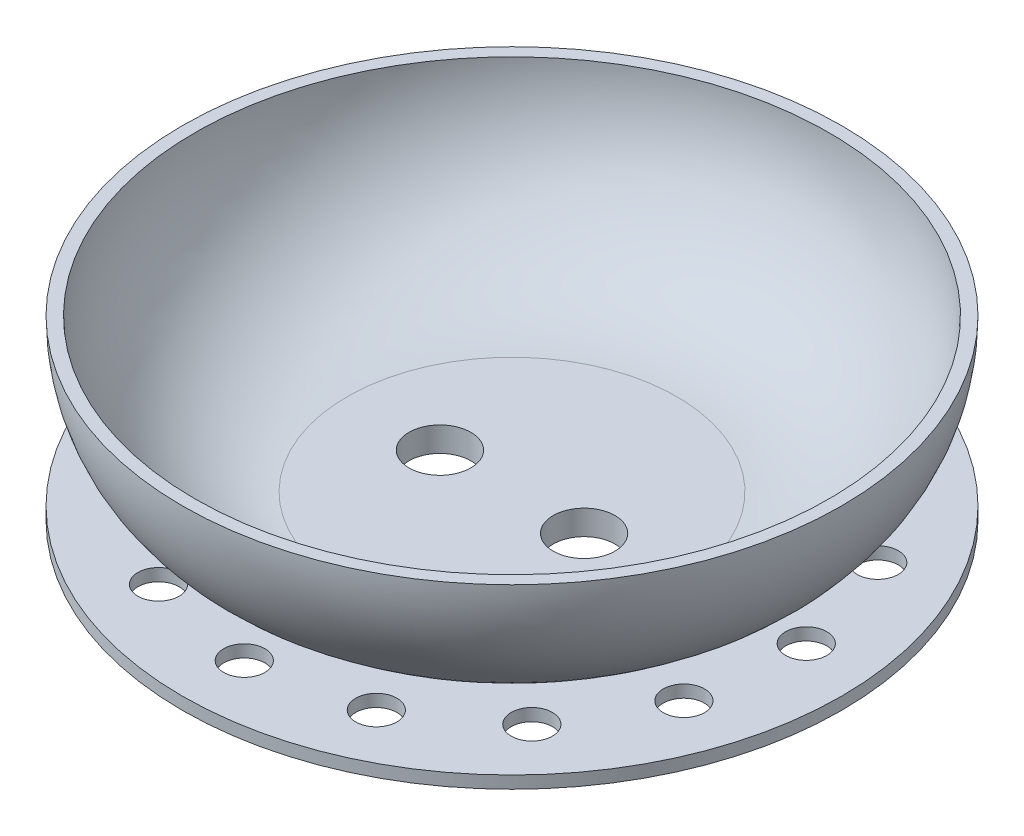
ISO-10303-21;
HEADER;
FILE_DESCRIPTION(('STEP AP214'),'2;1');
FILE_NAME('part.step','',(''),(''),'','','');
FILE_SCHEMA(('AUTOMOTIVE_DESIGN { 1 0 10303 214 1 1 1 1 }'));
ENDSEC;
DATA;
#1=APPLICATION_CONTEXT('core data for automotive mechanical design processes');
#2=APPLICATION_PROTOCOL_DEFINITION('international standard','automotive_design',2000,#1);
#3=PRODUCT_CONTEXT('',#1,'mechanical');
#4=PRODUCT('Part','Part','',(#3));
#5=PRODUCT_RELATED_PRODUCT_CATEGORY('part','',(#4));
#6=PRODUCT_DEFINITION_FORMATION('','',#4);
#7=PRODUCT_DEFINITION_CONTEXT('part definition',#1,'design');
#8=PRODUCT_DEFINITION('design','',#6,#7);
#9=PRODUCT_DEFINITION_SHAPE('','',#8);
#10=(LENGTH_UNIT() NAMED_UNIT(*) SI_UNIT(.MILLI.,.METRE.));
#11=(NAMED_UNIT(*) PLANE_ANGLE_UNIT() SI_UNIT($,.RADIAN.));
#12=(NAMED_UNIT(*) SI_UNIT($,.STERADIAN.) SOLID_ANGLE_UNIT());
#13=UNCERTAINTY_MEASURE_WITH_UNIT(LENGTH_MEASURE(1.E-05),#10,'distance_accuracy_value','');
#14=(GEOMETRIC_REPRESENTATION_CONTEXT(3) GLOBAL_UNCERTAINTY_ASSIGNED_CONTEXT((#13)) GLOBAL_UNIT_ASSIGNED_CONTEXT((#10,
#11,#12)) REPRESENTATION_CONTEXT('',''));
#15=CARTESIAN_POINT('',(0.,0.,0.));
#16=DIRECTION('',(0.,0.,1.));
#17=DIRECTION('',(1.,0.,0.));
#18=AXIS2_PLACEMENT_3D('',#15,#16,#17);
#19=CARTESIAN_POINT('',(0.,50.8,0.));
#20=DIRECTION('',(0.,1.,0.));
#21=DIRECTION('',(0.,0.,1.));
#22=AXIS2_PLACEMENT_3D('',#19,#20,#21);
#23=DEGENERATE_TOROIDAL_SURFACE('',#22,50.8,50.8,.T.);
#24=CARTESIAN_POINT('',(0.,50.8,0.));
#25=DIRECTION('',(0.,1.,0.));
#26=DIRECTION('',(0.,0.,1.));
#27=AXIS2_PLACEMENT_3D('',#24,#25,#26);
#28=CIRCLE('',#27,101.6);
#29=CARTESIAN_POINT('',(0.,50.8,101.6));
#30=VERTEX_POINT('',#29);
#31=EDGE_CURVE('E10',#30,#30,#28,.T.);
#32=ORIENTED_EDGE('',*,*,#31,.F.);
#33=EDGE_LOOP('',(#32));
#34=FACE_BOUND('',#33,.T.);
#35=CARTESIAN_POINT('',(0.,0.,0.));
#36=DIRECTION('',(0.,1.,0.));
#37=DIRECTION('',(0.,0.,1.));
#38=AXIS2_PLACEMENT_3D('',#35,#36,#37);
#39=CIRCLE('',#38,50.8);
#40=CARTESIAN_POINT('',(0.,0.,50.8));
#41=VERTEX_POINT('',#40);
#42=EDGE_CURVE('E48',#41,#41,#39,.T.);
#43=ORIENTED_EDGE('',*,*,#42,.T.);
#44=EDGE_LOOP('',(#43));
#45=FACE_BOUND('',#44,.T.);
#46=ADVANCED_FACE('F34',(#34,#45),#23,.T.);
#47=CARTESIAN_POINT('',(97.7900000000001,50.8,0.));
#48=DIRECTION('',(0.,-1.,0.));
#49=DIRECTION('',(0.,0.,-1.));
#50=AXIS2_PLACEMENT_3D('',#47,#48,#49);
#51=PLANE('',#50);
#52=CARTESIAN_POINT('',(0.,50.8,0.));
#53=DIRECTION('',(0.,1.,0.));
#54=DIRECTION('',(0.,0.,1.));
#55=AXIS2_PLACEMENT_3D('',#52,#53,#54);
#56=CIRCLE('',#55,97.7900000000001);
#57=CARTESIAN_POINT('',(0.,50.8,97.7900000000001));
#58=VERTEX_POINT('',#57);
#59=EDGE_CURVE('E40',#58,#58,#56,.T.);
#60=ORIENTED_EDGE('',*,*,#59,.F.);
#61=EDGE_LOOP('',(#60));
#62=FACE_BOUND('',#61,.T.);
#63=ORIENTED_EDGE('',*,*,#31,.T.);
#64=EDGE_LOOP('',(#63));
#65=FACE_BOUND('',#64,.T.);
#66=ADVANCED_FACE('F183',(#62,#65),#51,.F.);
#67=CARTESIAN_POINT('',(0.,50.8,0.));
#68=DIRECTION('',(0.,1.,0.));
#69=DIRECTION('',(0.,0.,1.));
#70=AXIS2_PLACEMENT_3D('',#67,#68,#69);
#71=TOROIDAL_SURFACE('',#70,50.8,46.99);
#72=CARTESIAN_POINT('',(0.,3.80999999999995,0.));
#73=DIRECTION('',(0.,1.,0.));
#74=DIRECTION('',(0.,0.,1.));
#75=AXIS2_PLACEMENT_3D('',#72,#73,#74);
#76=CIRCLE('',#75,50.8);
#77=CARTESIAN_POINT('',(0.,3.80999999999995,50.8));
#78=VERTEX_POINT('',#77);
#79=EDGE_CURVE('E44',#78,#78,#76,.T.);
#80=ORIENTED_EDGE('',*,*,#79,.F.);
#81=EDGE_LOOP('',(#80));
#82=FACE_BOUND('',#81,.T.);
#83=ORIENTED_EDGE('',*,*,#59,.T.);
#84=EDGE_LOOP('',(#83));
#85=FACE_BOUND('',#84,.T.);
#86=ADVANCED_FACE('F176',(#82,#85),#71,.F.);
#87=CARTESIAN_POINT('',(0.,3.80999999999998,0.));
#88=DIRECTION('',(0.,-1.,0.));
#89=DIRECTION('',(0.,0.,-1.));
#90=AXIS2_PLACEMENT_3D('',#87,#88,#89);
#91=PLANE('',#90);
#92=CARTESIAN_POINT('',(22.225,3.80999999999998,0.));
#93=DIRECTION('',(0.,1.,0.));
#94=DIRECTION('',(0.,0.,1.));
#95=AXIS2_PLACEMENT_3D('',#92,#93,#94);
#96=CIRCLE('',#95,9.52500000000001);
#97=CARTESIAN_POINT('',(22.225,3.80999999999998,9.52500000000001));
#98=VERTEX_POINT('',#97);
#99=EDGE_CURVE('E156',#98,#98,#96,.T.);
#100=ORIENTED_EDGE('',*,*,#99,.F.);
#101=EDGE_LOOP('',(#100));
#102=FACE_BOUND('',#101,.T.);
#103=CARTESIAN_POINT('',(-22.225,3.80999999999998,0.));
#104=DIRECTION('',(0.,1.,0.));
#105=DIRECTION('',(0.,0.,1.));
#106=AXIS2_PLACEMENT_3D('',#103,#104,#105);
#107=CIRCLE('',#106,9.525);
#108=CARTESIAN_POINT('',(-22.225,3.80999999999998,9.525));
#109=VERTEX_POINT('',#108);
#110=EDGE_CURVE('E150',#109,#109,#107,.T.);
#111=ORIENTED_EDGE('',*,*,#110,.F.);
#112=EDGE_LOOP('',(#111));
#113=FACE_BOUND('',#112,.T.);
#114=ORIENTED_EDGE('',*,*,#79,.T.);
#115=EDGE_LOOP('',(#114));
#116=FACE_BOUND('',#115,.T.);
#117=ADVANCED_FACE('F172',(#102,#113,#116),#91,.F.);
#118=CARTESIAN_POINT('',(0.,-3.81,0.));
#119=DIRECTION('',(0.,1.,0.));
#120=DIRECTION('',(0.,0.,1.));
#121=AXIS2_PLACEMENT_3D('',#118,#119,#120);
#122=CYLINDRICAL_SURFACE('',#121,101.6);
#123=CARTESIAN_POINT('',(0.,-3.81,0.));
#124=DIRECTION('',(0.,-1.,0.));
#125=DIRECTION('',(0.,0.,-1.));
#126=AXIS2_PLACEMENT_3D('',#123,#124,#125);
#127=CIRCLE('',#126,101.6);
#128=CARTESIAN_POINT('',(0.,-3.81,101.6));
#129=VERTEX_POINT('',#128);
#130=EDGE_CURVE('E53',#129,#129,#127,.T.);
#131=CARTESIAN_POINT('',(0.,0.,0.));
#132=DIRECTION('',(0.,-1.,0.));
#133=DIRECTION('',(0.,0.,-1.));
#134=AXIS2_PLACEMENT_3D('',#131,#132,#133);
#135=CIRCLE('',#134,101.6);
#136=CARTESIAN_POINT('',(0.,0.,101.6));
#137=VERTEX_POINT('',#136);
#138=EDGE_CURVE('E54',#137,#137,#135,.T.);
#139=CARTESIAN_POINT('',(0.,-3.81,101.6));
#140=CARTESIAN_POINT('',(0.,-3.7703125,101.6));
#141=CARTESIAN_POINT('',(0.,-3.730625,101.6));
#142=CARTESIAN_POINT('',(0.,-3.65125,101.6));
#143=CARTESIAN_POINT('',(0.,-3.6115625,101.6));
#144=CARTESIAN_POINT('',(0.,-3.5321875,101.6));
#145=CARTESIAN_POINT('',(0.,-3.4925,101.6));
#146=CARTESIAN_POINT('',(0.,-3.413125,101.6));
#147=CARTESIAN_POINT('',(0.,-3.3734375,101.6));
#148=CARTESIAN_POINT('',(0.,-3.2940625,101.6));
#149=CARTESIAN_POINT('',(0.,-3.254375,101.6));
#150=CARTESIAN_POINT('',(0.,-3.175,101.6));
#151=CARTESIAN_POINT('',(0.,-3.1353125,101.6));
#152=CARTESIAN_POINT('',(0.,-3.0559375,101.6));
#153=CARTESIAN_POINT('',(0.,-3.01625,101.6));
#154=CARTESIAN_POINT('',(0.,-2.936875,101.6));
#155=CARTESIAN_POINT('',(0.,-2.8971875,101.6));
#156=CARTESIAN_POINT('',(0.,-2.8178125,101.6));
#157=CARTESIAN_POINT('',(0.,-2.778125,101.6));
#158=CARTESIAN_POINT('',(0.,-2.69875,101.6));
#159=CARTESIAN_POINT('',(0.,-2.6590625,101.6));
#160=CARTESIAN_POINT('',(0.,-2.5796875,101.6));
#161=CARTESIAN_POINT('',(0.,-2.54,101.6));
#162=CARTESIAN_POINT('',(0.,-2.460625,101.6));
#163=CARTESIAN_POINT('',(0.,-2.4209375,101.6));
#164=CARTESIAN_POINT('',(0.,-2.3415625,101.6));
#165=CARTESIAN_POINT('',(0.,-2.301875,101.6));
#166=CARTESIAN_POINT('',(0.,-2.2225,101.6));
#167=CARTESIAN_POINT('',(0.,-2.1828125,101.6));
#168=CARTESIAN_POINT('',(0.,-2.1034375,101.6));
#169=CARTESIAN_POINT('',(0.,-2.06375,101.6));
#170=CARTESIAN_POINT('',(0.,-1.984375,101.6));
#171=CARTESIAN_POINT('',(0.,-1.9446875,101.6));
#172=CARTESIAN_POINT('',(0.,-1.8653125,101.6));
#173=CARTESIAN_POINT('',(0.,-1.825625,101.6));
#174=CARTESIAN_POINT('',(0.,-1.74625,101.6));
#175=CARTESIAN_POINT('',(0.,-1.7065625,101.6));
#176=CARTESIAN_POINT('',(0.,-1.6271875,101.6));
#177=CARTESIAN_POINT('',(0.,-1.5875,101.6));
#178=CARTESIAN_POINT('',(0.,-1.508125,101.6));
#179=CARTESIAN_POINT('',(0.,-1.4684375,101.6));
#180=CARTESIAN_POINT('',(0.,-1.3890625,101.6));
#181=CARTESIAN_POINT('',(0.,-1.349375,101.6));
#182=CARTESIAN_POINT('',(0.,-1.27,101.6));
#183=CARTESIAN_POINT('',(0.,-1.2303125,101.6));
#184=CARTESIAN_POINT('',(0.,-1.1509375,101.6));
#185=CARTESIAN_POINT('',(0.,-1.11125,101.6));
#186=CARTESIAN_POINT('',(0.,-1.031875,101.6));
#187=CARTESIAN_POINT('',(0.,-0.9921875,101.6));
#188=CARTESIAN_POINT('',(0.,-0.9128125,101.6));
#189=CARTESIAN_POINT('',(0.,-0.873125,101.6));
#190=CARTESIAN_POINT('',(0.,-0.79375,101.6));
#191=CARTESIAN_POINT('',(0.,-0.7540625,101.6));
#192=CARTESIAN_POINT('',(0.,-0.6746875,101.6));
#193=CARTESIAN_POINT('',(0.,-0.635,101.6));
#194=CARTESIAN_POINT('',(0.,-0.555625,101.6));
#195=CARTESIAN_POINT('',(0.,-0.5159375,101.6));
#196=CARTESIAN_POINT('',(0.,-0.4365625,101.6));
#197=CARTESIAN_POINT('',(0.,-0.396875,101.6));
#198=CARTESIAN_POINT('',(0.,-0.3175,101.6));
#199=CARTESIAN_POINT('',(0.,-0.2778125,101.6));
#200=CARTESIAN_POINT('',(0.,-0.1984375,101.6));
#201=CARTESIAN_POINT('',(0.,-0.15875,101.6));
#202=CARTESIAN_POINT('',(0.,-0.0793749999999999,101.6));
#203=CARTESIAN_POINT('',(0.,-0.0396874999999999,101.6));
#204=CARTESIAN_POINT('',(0.,0.,101.6));
#205=B_SPLINE_CURVE_WITH_KNOTS('',3,(#139,#140,#141,#142,#143,#144,#145,#146,#147,#148,#149,
#150,#151,#152,#153,#154,#155,#156,#157,#158,#159,#160,#161,#162,#163,#164,#165,#166,#167,#168,
#169,#170,#171,#172,#173,#174,#175,#176,#177,#178,#179,#180,#181,#182,#183,#184,#185,#186,#187,
#188,#189,#190,#191,#192,#193,#194,#195,#196,#197,#198,#199,#200,#201,#202,#203,#204),
.UNSPECIFIED.,.F.,.F.,(4,2,2,2,2,2,2,2,2,2,2,2,2,2,2,2,2,2,2,2,2,2,2,2,2,2,2,2,2,2,2,2,4),(0.,
0.1190625,0.238125,0.3571875,0.47625,0.595312499999999,0.714375,0.833437499999999,
0.952499999999999,1.0715625,1.190625,1.3096875,1.42875,1.5478125,1.666875,1.7859375,1.905,
2.0240625,2.143125,2.2621875,2.38125,2.5003125,2.619375,2.7384375,2.8575,2.9765625,3.095625,
3.2146875,3.33375,3.4528125,3.571875,3.6909375,3.81),.UNSPECIFIED.);
#206=EDGE_CURVE('BSEAM175',#129,#137,#205,.T.);
#207=ORIENTED_EDGE('',*,*,#130,.F.);
#208=ORIENTED_EDGE('',*,*,#138,.T.);
#209=ORIENTED_EDGE('',*,*,#206,.T.);
#210=ORIENTED_EDGE('',*,*,#206,.F.);
#211=EDGE_LOOP('',(#207,#209,#208,#210));
#212=FACE_BOUND('',#211,.T.);
#213=ADVANCED_FACE('F175',(#212),#122,.T.);
#214=CARTESIAN_POINT('',(0.,-3.81,0.));
#215=DIRECTION('',(0.,-1.,0.));
#216=DIRECTION('',(0.,0.,-1.));
#217=AXIS2_PLACEMENT_3D('',#214,#215,#216);
#218=PLANE('',#217);
#219=CARTESIAN_POINT('',(22.225,-3.81,0.));
#220=DIRECTION('',(0.,1.,0.));
#221=DIRECTION('',(0.,0.,1.));
#222=AXIS2_PLACEMENT_3D('',#219,#220,#221);
#223=CIRCLE('',#222,9.52500000000001);
#224=CARTESIAN_POINT('',(22.225,-3.81,9.52500000000001));
#225=VERTEX_POINT('',#224);
#226=EDGE_CURVE('E127',#225,#225,#223,.T.);
#227=ORIENTED_EDGE('',*,*,#226,.T.);
#228=EDGE_LOOP('',(#227));
#229=FACE_BOUND('',#228,.T.);
#230=CARTESIAN_POINT('',(-22.225,-3.81,0.));
#231=DIRECTION('',(0.,1.,0.));
#232=DIRECTION('',(0.,0.,1.));
#233=AXIS2_PLACEMENT_3D('',#230,#231,#232);
#234=CIRCLE('',#233,9.525);
#235=CARTESIAN_POINT('',(-22.225,-3.81,9.525));
#236=VERTEX_POINT('',#235);
#237=EDGE_CURVE('E153',#236,#236,#234,.T.);
#238=ORIENTED_EDGE('',*,*,#237,.T.);
#239=EDGE_LOOP('',(#238));
#240=FACE_BOUND('',#239,.T.);
#241=CARTESIAN_POINT('',(-61.346605343159,-3.81,55.2367315549236));
#242=DIRECTION('',(0.,-1.,0.));
#243=DIRECTION('',(0.743144825477395,0.,-0.669130606358857));
#244=AXIS2_PLACEMENT_3D('',#241,#242,#243);
#245=CIRCLE('',#244,6.35);
#246=CARTESIAN_POINT('',(-56.6276357013775,-3.81,50.9877522045449));
#247=VERTEX_POINT('',#246);
#248=EDGE_CURVE('E113',#247,#247,#245,.T.);
#249=ORIENTED_EDGE('',*,*,#248,.F.);
#250=EDGE_LOOP('',(#249));
#251=FACE_BOUND('',#250,.T.);
#252=CARTESIAN_POINT('',(-78.509715420165,-3.81,25.5093528856517));
#253=DIRECTION('',(0.,-1.,0.));
#254=DIRECTION('',(0.951056516295154,0.,-0.309016994374945));
#255=AXIS2_PLACEMENT_3D('',#252,#253,#254);
#256=CIRCLE('',#255,6.35);
#257=CARTESIAN_POINT('',(-72.4705065416908,-3.81,23.5470949713708));
#258=VERTEX_POINT('',#257);
#259=EDGE_CURVE('E107',#258,#258,#256,.T.);
#260=ORIENTED_EDGE('',*,*,#259,.F.);
#261=EDGE_LOOP('',(#260));
#262=FACE_BOUND('',#261,.T.);
#263=CARTESIAN_POINT('',(-82.0977824626509,-3.81,-8.62882464274509));
#264=DIRECTION('',(0.,-1.,0.));
#265=DIRECTION('',(0.994521895368273,0.,0.104528463267657));
#266=AXIS2_PLACEMENT_3D('',#263,#264,#265);
#267=CIRCLE('',#266,6.35);
#268=CARTESIAN_POINT('',(-75.7825684270624,-3.81,-7.96506890099547));
#269=VERTEX_POINT('',#268);
#270=EDGE_CURVE('E101',#269,#269,#267,.T.);
#271=ORIENTED_EDGE('',*,*,#270,.F.);
#272=EDGE_LOOP('',(#271));
#273=FACE_BOUND('',#272,.T.);
#274=CARTESIAN_POINT('',(-71.4903970824052,-3.81,-41.2750000000003));
#275=DIRECTION('',(0.,-1.,0.));
#276=DIRECTION('',(0.866025403784436,0.,0.500000000000004));
#277=AXIS2_PLACEMENT_3D('',#274,#275,#276);
#278=CIRCLE('',#277,6.35);
#279=CARTESIAN_POINT('',(-65.9911357683741,-3.81,-38.1000000000003));
#280=VERTEX_POINT('',#279);
#281=EDGE_CURVE('E95',#280,#280,#278,.T.);
#282=ORIENTED_EDGE('',*,*,#281,.F.);
#283=EDGE_LOOP('',(#282));
#284=FACE_BOUND('',#283,.T.);
#285=CARTESIAN_POINT('',(-48.5216725767433,-3.81,-66.7843528856522));
#286=DIRECTION('',(0.,-1.,0.));
#287=DIRECTION('',(0.587785252292469,0.,0.80901699437495));
#288=AXIS2_PLACEMENT_3D('',#285,#286,#287);
#289=CIRCLE('',#288,6.35);
#290=CARTESIAN_POINT('',(-44.7892362246861,-3.81,-61.6470949713712));
#291=VERTEX_POINT('',#290);
#292=EDGE_CURVE('E89',#291,#291,#289,.T.);
#293=ORIENTED_EDGE('',*,*,#292,.F.);
#294=EDGE_LOOP('',(#293));
#295=FACE_BOUND('',#294,.T.);
#296=CARTESIAN_POINT('',(-17.1631100770055,-3.81,-80.7460844405758));
#297=DIRECTION('',(0.,-1.,0.));
#298=DIRECTION('',(0.207911690817753,0.,0.978147600733807));
#299=AXIS2_PLACEMENT_3D('',#296,#297,#298);
#300=CIRCLE('',#299,6.35);
#301=CARTESIAN_POINT('',(-15.8428708403128,-3.81,-74.5348471759161));
#302=VERTEX_POINT('',#301);
#303=EDGE_CURVE('E83',#302,#302,#300,.T.);
#304=ORIENTED_EDGE('',*,*,#303,.F.);
#305=EDGE_LOOP('',(#304));
#306=FACE_BOUND('',#305,.T.);
#307=CARTESIAN_POINT('',(17.1631100770066,-3.81,-80.7460844405755));
#308=DIRECTION('',(0.,-1.,0.));
#309=DIRECTION('',(-0.207911690817766,0.,0.978147600733804));
#310=AXIS2_PLACEMENT_3D('',#307,#308,#309);
#311=CIRCLE('',#310,6.35);
#312=CARTESIAN_POINT('',(15.8428708403138,-3.81,-74.5348471759159));
#313=VERTEX_POINT('',#312);
#314=EDGE_CURVE('E75',#313,#313,#311,.T.);
#315=ORIENTED_EDGE('',*,*,#314,.F.);
#316=EDGE_LOOP('',(#315));
#317=FACE_BOUND('',#316,.T.);
#318=CARTESIAN_POINT('',(48.5216725767442,-3.81,-66.7843528856515));
#319=DIRECTION('',(0.,-1.,0.));
#320=DIRECTION('',(-0.58778525229248,0.,0.809016994374943));
#321=AXIS2_PLACEMENT_3D('',#318,#319,#320);
#322=CIRCLE('',#321,6.35);
#323=CARTESIAN_POINT('',(44.789236224687,-3.81,-61.6470949713706));
#324=VERTEX_POINT('',#323);
#325=EDGE_CURVE('E76',#324,#324,#322,.T.);
#326=ORIENTED_EDGE('',*,*,#325,.F.);
#327=EDGE_LOOP('',(#326));
#328=FACE_BOUND('',#327,.T.);
#329=CARTESIAN_POINT('',(71.4903970824058,-3.81,-41.2749999999993));
#330=DIRECTION('',(0.,-1.,0.));
#331=DIRECTION('',(-0.866025403784443,0.,0.499999999999992));
#332=AXIS2_PLACEMENT_3D('',#329,#330,#331);
#333=CIRCLE('',#332,6.35);
#334=CARTESIAN_POINT('',(65.9911357683746,-3.81,-38.0999999999994));
#335=VERTEX_POINT('',#334);
#336=EDGE_CURVE('E143',#335,#335,#333,.T.);
#337=ORIENTED_EDGE('',*,*,#336,.F.);
#338=EDGE_LOOP('',(#337));
#339=FACE_BOUND('',#338,.T.);
#340=CARTESIAN_POINT('',(82.0977824626511,-3.81,-8.62882464274398));
#341=DIRECTION('',(0.,-1.,0.));
#342=DIRECTION('',(-0.994521895368274,0.,0.104528463267644));
#343=AXIS2_PLACEMENT_3D('',#340,#341,#342);
#344=CIRCLE('',#343,6.35);
#345=CARTESIAN_POINT('',(75.7825684270625,-3.81,-7.96506890099445));
#346=VERTEX_POINT('',#345);
#347=EDGE_CURVE('E137',#346,#346,#344,.T.);
#348=ORIENTED_EDGE('',*,*,#347,.F.);
#349=EDGE_LOOP('',(#348));
#350=FACE_BOUND('',#349,.T.);
#351=CARTESIAN_POINT('',(78.5097154201647,-3.81,25.5093528856527));
#352=DIRECTION('',(0.,-1.,0.));
#353=DIRECTION('',(-0.95105651629515,0.,-0.309016994374957));
#354=AXIS2_PLACEMENT_3D('',#351,#352,#353);
#355=CIRCLE('',#354,6.35);
#356=CARTESIAN_POINT('',(72.4705065416905,-3.81,23.5470949713718));
#357=VERTEX_POINT('',#356);
#358=EDGE_CURVE('E131',#357,#357,#355,.T.);
#359=ORIENTED_EDGE('',*,*,#358,.F.);
#360=EDGE_LOOP('',(#359));
#361=FACE_BOUND('',#360,.T.);
#362=CARTESIAN_POINT('',(61.3466053431582,-3.81,55.2367315549245));
#363=DIRECTION('',(0.,-1.,0.));
#364=DIRECTION('',(-0.743144825477386,0.,-0.669130606358867));
#365=AXIS2_PLACEMENT_3D('',#362,#363,#364);
#366=CIRCLE('',#365,6.35);
#367=CARTESIAN_POINT('',(56.6276357013768,-3.81,50.9877522045457));
#368=VERTEX_POINT('',#367);
#369=EDGE_CURVE('E123',#368,#368,#366,.T.);
#370=ORIENTED_EDGE('',*,*,#369,.F.);
#371=EDGE_LOOP('',(#370));
#372=FACE_BOUND('',#371,.T.);
#373=CARTESIAN_POINT('',(33.5761098859064,-3.81,75.4131775283971));
#374=DIRECTION('',(0.,-1.,0.));
#375=DIRECTION('',(-0.406736643075789,0.,-0.913545457642606));
#376=AXIS2_PLACEMENT_3D('',#373,#374,#375);
#377=CIRCLE('',#376,6.35);
#378=CARTESIAN_POINT('',(30.9933322023751,-3.81,69.6121638723666));
#379=VERTEX_POINT('',#378);
#380=EDGE_CURVE('E124',#379,#379,#377,.T.);
#381=ORIENTED_EDGE('',*,*,#380,.F.);
#382=EDGE_LOOP('',(#381));
#383=FACE_BOUND('',#382,.T.);
#384=CARTESIAN_POINT('',(-33.5761098859074,-3.81,75.4131775283967));
#385=DIRECTION('',(0.,-1.,0.));
#386=DIRECTION('',(0.406736643075801,0.,-0.913545457642601));
#387=AXIS2_PLACEMENT_3D('',#384,#385,#386);
#388=CIRCLE('',#387,6.35);
#389=CARTESIAN_POINT('',(-30.993332202376,-3.81,69.6121638723662));
#390=VERTEX_POINT('',#389);
#391=EDGE_CURVE('E68',#390,#390,#388,.T.);
#392=ORIENTED_EDGE('',*,*,#391,.F.);
#393=EDGE_LOOP('',(#392));
#394=FACE_BOUND('',#393,.T.);
#395=CARTESIAN_POINT('',(0.,-3.81,82.55));
#396=DIRECTION('',(0.,-1.,0.));
#397=DIRECTION('',(0.,0.,-1.));
#398=AXIS2_PLACEMENT_3D('',#395,#396,#397);
#399=CIRCLE('',#398,6.35);
#400=CARTESIAN_POINT('',(0.,-3.81,76.2));
#401=VERTEX_POINT('',#400);
#402=EDGE_CURVE('E62',#401,#401,#399,.T.);
#403=ORIENTED_EDGE('',*,*,#402,.F.);
#404=EDGE_LOOP('',(#403));
#405=FACE_BOUND('',#404,.T.);
#406=ORIENTED_EDGE('',*,*,#130,.T.);
#407=EDGE_LOOP('',(#406));
#408=FACE_BOUND('',#407,.T.);
#409=ADVANCED_FACE('F162',(#229,#240,#251,#262,#273,#284,#295,#306,#317,#328,#339,#350,#361,
#372,#383,#394,#405,#408),#218,.T.);
#410=CARTESIAN_POINT('',(0.,0.,0.));
#411=DIRECTION('',(0.,-1.,0.));
#412=DIRECTION('',(0.,0.,-1.));
#413=AXIS2_PLACEMENT_3D('',#410,#411,#412);
#414=PLANE('',#413);
#415=CARTESIAN_POINT('',(-61.346605343159,0.,55.2367315549236));
#416=DIRECTION('',(0.,-1.,0.));
#417=DIRECTION('',(0.,0.,-1.));
#418=AXIS2_PLACEMENT_3D('',#415,#416,#417);
#419=CIRCLE('',#418,6.35);
#420=CARTESIAN_POINT('',(-61.346605343159,0.,48.8867315549236));
#421=VERTEX_POINT('',#420);
#422=EDGE_CURVE('E71',#421,#421,#419,.F.);
#423=ORIENTED_EDGE('',*,*,#422,.F.);
#424=EDGE_LOOP('',(#423));
#425=FACE_BOUND('',#424,.T.);
#426=CARTESIAN_POINT('',(-78.509715420165,0.,25.5093528856517));
#427=DIRECTION('',(0.,-1.,0.));
#428=DIRECTION('',(0.,0.,-1.));
#429=AXIS2_PLACEMENT_3D('',#426,#427,#428);
#430=CIRCLE('',#429,6.35);
#431=CARTESIAN_POINT('',(-78.509715420165,0.,19.1593528856517));
#432=VERTEX_POINT('',#431);
#433=EDGE_CURVE('E110',#432,#432,#430,.F.);
#434=ORIENTED_EDGE('',*,*,#433,.F.);
#435=EDGE_LOOP('',(#434));
#436=FACE_BOUND('',#435,.T.);
#437=CARTESIAN_POINT('',(-82.0977824626509,0.,-8.62882464274509));
#438=DIRECTION('',(0.,-1.,0.));
#439=DIRECTION('',(0.,0.,-1.));
#440=AXIS2_PLACEMENT_3D('',#437,#438,#439);
#441=CIRCLE('',#440,6.35);
#442=CARTESIAN_POINT('',(-82.0977824626509,0.,-14.9788246427451));
#443=VERTEX_POINT('',#442);
#444=EDGE_CURVE('E104',#443,#443,#441,.F.);
#445=ORIENTED_EDGE('',*,*,#444,.F.);
#446=EDGE_LOOP('',(#445));
#447=FACE_BOUND('',#446,.T.);
#448=CARTESIAN_POINT('',(-71.4903970824052,0.,-41.2750000000003));
#449=DIRECTION('',(0.,-1.,0.));
#450=DIRECTION('',(0.,0.,-1.));
#451=AXIS2_PLACEMENT_3D('',#448,#449,#450);
#452=CIRCLE('',#451,6.35);
#453=CARTESIAN_POINT('',(-71.4903970824052,0.,-47.6250000000003));
#454=VERTEX_POINT('',#453);
#455=EDGE_CURVE('E98',#454,#454,#452,.F.);
#456=ORIENTED_EDGE('',*,*,#455,.F.);
#457=EDGE_LOOP('',(#456));
#458=FACE_BOUND('',#457,.T.);
#459=CARTESIAN_POINT('',(-48.5216725767433,0.,-66.7843528856522));
#460=DIRECTION('',(0.,-1.,0.));
#461=DIRECTION('',(0.,0.,-1.));
#462=AXIS2_PLACEMENT_3D('',#459,#460,#461);
#463=CIRCLE('',#462,6.35);
#464=CARTESIAN_POINT('',(-48.5216725767433,0.,-73.1343528856521));
#465=VERTEX_POINT('',#464);
#466=EDGE_CURVE('E92',#465,#465,#463,.F.);
#467=ORIENTED_EDGE('',*,*,#466,.F.);
#468=EDGE_LOOP('',(#467));
#469=FACE_BOUND('',#468,.T.);
#470=CARTESIAN_POINT('',(-17.1631100770055,0.,-80.7460844405758));
#471=DIRECTION('',(0.,-1.,0.));
#472=DIRECTION('',(0.,0.,-1.));
#473=AXIS2_PLACEMENT_3D('',#470,#471,#472);
#474=CIRCLE('',#473,6.35);
#475=CARTESIAN_POINT('',(-17.1631100770055,0.,-87.0960844405758));
#476=VERTEX_POINT('',#475);
#477=EDGE_CURVE('E86',#476,#476,#474,.F.);
#478=ORIENTED_EDGE('',*,*,#477,.F.);
#479=EDGE_LOOP('',(#478));
#480=FACE_BOUND('',#479,.T.);
#481=CARTESIAN_POINT('',(17.1631100770066,0.,-80.7460844405755));
#482=DIRECTION('',(0.,-1.,0.));
#483=DIRECTION('',(0.,0.,-1.));
#484=AXIS2_PLACEMENT_3D('',#481,#482,#483);
#485=CIRCLE('',#484,6.35);
#486=CARTESIAN_POINT('',(17.1631100770066,0.,-87.0960844405755));
#487=VERTEX_POINT('',#486);
#488=EDGE_CURVE('E80',#487,#487,#485,.F.);
#489=ORIENTED_EDGE('',*,*,#488,.F.);
#490=EDGE_LOOP('',(#489));
#491=FACE_BOUND('',#490,.T.);
#492=CARTESIAN_POINT('',(48.5216725767442,0.,-66.7843528856515));
#493=DIRECTION('',(0.,-1.,0.));
#494=DIRECTION('',(0.,0.,-1.));
#495=AXIS2_PLACEMENT_3D('',#492,#493,#494);
#496=CIRCLE('',#495,6.35);
#497=CARTESIAN_POINT('',(48.5216725767442,0.,-73.1343528856515));
#498=VERTEX_POINT('',#497);
#499=EDGE_CURVE('E72',#498,#498,#496,.F.);
#500=ORIENTED_EDGE('',*,*,#499,.F.);
#501=EDGE_LOOP('',(#500));
#502=FACE_BOUND('',#501,.T.);
#503=CARTESIAN_POINT('',(71.4903970824058,0.,-41.2749999999993));
#504=DIRECTION('',(0.,-1.,0.));
#505=DIRECTION('',(0.,0.,-1.));
#506=AXIS2_PLACEMENT_3D('',#503,#504,#505);
#507=CIRCLE('',#506,6.35);
#508=CARTESIAN_POINT('',(71.4903970824058,0.,-47.6249999999993));
#509=VERTEX_POINT('',#508);
#510=EDGE_CURVE('E79',#509,#509,#507,.F.);
#511=ORIENTED_EDGE('',*,*,#510,.F.);
#512=EDGE_LOOP('',(#511));
#513=FACE_BOUND('',#512,.T.);
#514=CARTESIAN_POINT('',(82.0977824626511,0.,-8.62882464274398));
#515=DIRECTION('',(0.,-1.,0.));
#516=DIRECTION('',(0.,0.,-1.));
#517=AXIS2_PLACEMENT_3D('',#514,#515,#516);
#518=CIRCLE('',#517,6.35);
#519=CARTESIAN_POINT('',(82.0977824626511,0.,-14.978824642744));
#520=VERTEX_POINT('',#519);
#521=EDGE_CURVE('E140',#520,#520,#518,.F.);
#522=ORIENTED_EDGE('',*,*,#521,.F.);
#523=EDGE_LOOP('',(#522));
#524=FACE_BOUND('',#523,.T.);
#525=CARTESIAN_POINT('',(78.5097154201647,0.,25.5093528856527));
#526=DIRECTION('',(0.,-1.,0.));
#527=DIRECTION('',(0.,0.,-1.));
#528=AXIS2_PLACEMENT_3D('',#525,#526,#527);
#529=CIRCLE('',#528,6.35);
#530=CARTESIAN_POINT('',(78.5097154201647,0.,19.1593528856527));
#531=VERTEX_POINT('',#530);
#532=EDGE_CURVE('E134',#531,#531,#529,.F.);
#533=ORIENTED_EDGE('',*,*,#532,.F.);
#534=EDGE_LOOP('',(#533));
#535=FACE_BOUND('',#534,.T.);
#536=CARTESIAN_POINT('',(61.3466053431582,0.,55.2367315549245));
#537=DIRECTION('',(0.,-1.,0.));
#538=DIRECTION('',(0.,0.,-1.));
#539=AXIS2_PLACEMENT_3D('',#536,#537,#538);
#540=CIRCLE('',#539,6.35);
#541=CARTESIAN_POINT('',(61.3466053431582,0.,48.8867315549245));
#542=VERTEX_POINT('',#541);
#543=EDGE_CURVE('E128',#542,#542,#540,.F.);
#544=ORIENTED_EDGE('',*,*,#543,.F.);
#545=EDGE_LOOP('',(#544));
#546=FACE_BOUND('',#545,.T.);
#547=CARTESIAN_POINT('',(33.5761098859064,0.,75.4131775283971));
#548=DIRECTION('',(0.,-1.,0.));
#549=DIRECTION('',(0.,0.,-1.));
#550=AXIS2_PLACEMENT_3D('',#547,#548,#549);
#551=CIRCLE('',#550,6.35);
#552=CARTESIAN_POINT('',(33.5761098859064,0.,69.0631775283971));
#553=VERTEX_POINT('',#552);
#554=EDGE_CURVE('E120',#553,#553,#551,.F.);
#555=ORIENTED_EDGE('',*,*,#554,.F.);
#556=EDGE_LOOP('',(#555));
#557=FACE_BOUND('',#556,.T.);
#558=CARTESIAN_POINT('',(-33.5761098859074,0.,75.4131775283967));
#559=DIRECTION('',(0.,-1.,0.));
#560=DIRECTION('',(0.,0.,-1.));
#561=AXIS2_PLACEMENT_3D('',#558,#559,#560);
#562=CIRCLE('',#561,6.35);
#563=CARTESIAN_POINT('',(-33.5761098859074,0.,69.0631775283967));
#564=VERTEX_POINT('',#563);
#565=EDGE_CURVE('E65',#564,#564,#562,.F.);
#566=ORIENTED_EDGE('',*,*,#565,.F.);
#567=EDGE_LOOP('',(#566));
#568=FACE_BOUND('',#567,.T.);
#569=CARTESIAN_POINT('',(0.,0.,82.55));
#570=DIRECTION('',(0.,-1.,0.));
#571=DIRECTION('',(0.,0.,-1.));
#572=AXIS2_PLACEMENT_3D('',#569,#570,#571);
#573=CIRCLE('',#572,6.35);
#574=CARTESIAN_POINT('',(0.,0.,76.2));
#575=VERTEX_POINT('',#574);
#576=EDGE_CURVE('E57',#575,#575,#573,.F.);
#577=ORIENTED_EDGE('',*,*,#576,.F.);
#578=EDGE_LOOP('',(#577));
#579=FACE_BOUND('',#578,.T.);
#580=ORIENTED_EDGE('',*,*,#42,.F.);
#581=EDGE_LOOP('',(#580));
#582=FACE_BOUND('',#581,.T.);
#583=ORIENTED_EDGE('',*,*,#138,.F.);
#584=EDGE_LOOP('',(#583));
#585=FACE_BOUND('',#584,.T.);
#586=ADVANCED_FACE('F196',(#425,#436,#447,#458,#469,#480,#491,#502,#513,#524,#535,#546,#557,
#568,#579,#582,#585),#414,.F.);
#587=CARTESIAN_POINT('',(0.,17.9605122421383,82.55));
#588=DIRECTION('',(0.,-1.,0.));
#589=DIRECTION('',(0.,0.,-1.));
#590=AXIS2_PLACEMENT_3D('',#587,#588,#589);
#591=CYLINDRICAL_SURFACE('',#590,6.35);
#592=ORIENTED_EDGE('',*,*,#576,.T.);
#593=EDGE_LOOP('',(#592));
#594=FACE_BOUND('',#593,.T.);
#595=ORIENTED_EDGE('',*,*,#402,.T.);
#596=EDGE_LOOP('',(#595));
#597=FACE_BOUND('',#596,.T.);
#598=ADVANCED_FACE('F199',(#594,#597),#591,.F.);
#599=CARTESIAN_POINT('',(-33.5761098859074,17.9605122421383,75.4131775283967));
#600=DIRECTION('',(0.,-1.,0.));
#601=DIRECTION('',(0.,0.,-1.));
#602=AXIS2_PLACEMENT_3D('',#599,#600,#601);
#603=CYLINDRICAL_SURFACE('',#602,6.35);
#604=ORIENTED_EDGE('',*,*,#565,.T.);
#605=EDGE_LOOP('',(#604));
#606=FACE_BOUND('',#605,.T.);
#607=ORIENTED_EDGE('',*,*,#391,.T.);
#608=EDGE_LOOP('',(#607));
#609=FACE_BOUND('',#608,.T.);
#610=ADVANCED_FACE('F215',(#606,#609),#603,.F.);
#611=CARTESIAN_POINT('',(33.5761098859064,17.9605122421383,75.4131775283971));
#612=DIRECTION('',(0.,-1.,0.));
#613=DIRECTION('',(0.,0.,-1.));
#614=AXIS2_PLACEMENT_3D('',#611,#612,#613);
#615=CYLINDRICAL_SURFACE('',#614,6.35);
#616=ORIENTED_EDGE('',*,*,#554,.T.);
#617=EDGE_LOOP('',(#616));
#618=FACE_BOUND('',#617,.T.);
#619=ORIENTED_EDGE('',*,*,#380,.T.);
#620=EDGE_LOOP('',(#619));
#621=FACE_BOUND('',#620,.T.);
#622=ADVANCED_FACE('F219',(#618,#621),#615,.F.);
#623=CARTESIAN_POINT('',(61.3466053431582,17.9605122421383,55.2367315549245));
#624=DIRECTION('',(0.,-1.,0.));
#625=DIRECTION('',(0.,0.,-1.));
#626=AXIS2_PLACEMENT_3D('',#623,#624,#625);
#627=CYLINDRICAL_SURFACE('',#626,6.35);
#628=ORIENTED_EDGE('',*,*,#543,.T.);
#629=EDGE_LOOP('',(#628));
#630=FACE_BOUND('',#629,.T.);
#631=ORIENTED_EDGE('',*,*,#369,.T.);
#632=EDGE_LOOP('',(#631));
#633=FACE_BOUND('',#632,.T.);
#634=ADVANCED_FACE('F256',(#630,#633),#627,.F.);
#635=CARTESIAN_POINT('',(78.5097154201647,17.9605122421383,25.5093528856527));
#636=DIRECTION('',(0.,-1.,0.));
#637=DIRECTION('',(0.,0.,-1.));
#638=AXIS2_PLACEMENT_3D('',#635,#636,#637);
#639=CYLINDRICAL_SURFACE('',#638,6.35);
#640=ORIENTED_EDGE('',*,*,#532,.T.);
#641=EDGE_LOOP('',(#640));
#642=FACE_BOUND('',#641,.T.);
#643=ORIENTED_EDGE('',*,*,#358,.T.);
#644=EDGE_LOOP('',(#643));
#645=FACE_BOUND('',#644,.T.);
#646=ADVANCED_FACE('F260',(#642,#645),#639,.F.);
#647=CARTESIAN_POINT('',(82.0977824626511,17.9605122421383,-8.62882464274398));
#648=DIRECTION('',(0.,-1.,0.));
#649=DIRECTION('',(0.,0.,-1.));
#650=AXIS2_PLACEMENT_3D('',#647,#648,#649);
#651=CYLINDRICAL_SURFACE('',#650,6.35);
#652=ORIENTED_EDGE('',*,*,#521,.T.);
#653=EDGE_LOOP('',(#652));
#654=FACE_BOUND('',#653,.T.);
#655=ORIENTED_EDGE('',*,*,#347,.T.);
#656=EDGE_LOOP('',(#655));
#657=FACE_BOUND('',#656,.T.);
#658=ADVANCED_FACE('F264',(#654,#657),#651,.F.);
#659=CARTESIAN_POINT('',(71.4903970824058,17.9605122421383,-41.2749999999993));
#660=DIRECTION('',(0.,-1.,0.));
#661=DIRECTION('',(0.,0.,-1.));
#662=AXIS2_PLACEMENT_3D('',#659,#660,#661);
#663=CYLINDRICAL_SURFACE('',#662,6.35);
#664=ORIENTED_EDGE('',*,*,#510,.T.);
#665=EDGE_LOOP('',(#664));
#666=FACE_BOUND('',#665,.T.);
#667=ORIENTED_EDGE('',*,*,#336,.T.);
#668=EDGE_LOOP('',(#667));
#669=FACE_BOUND('',#668,.T.);
#670=ADVANCED_FACE('F225',(#666,#669),#663,.F.);
#671=CARTESIAN_POINT('',(48.5216725767442,17.9605122421383,-66.7843528856515));
#672=DIRECTION('',(0.,-1.,0.));
#673=DIRECTION('',(0.,0.,-1.));
#674=AXIS2_PLACEMENT_3D('',#671,#672,#673);
#675=CYLINDRICAL_SURFACE('',#674,6.35);
#676=ORIENTED_EDGE('',*,*,#499,.T.);
#677=EDGE_LOOP('',(#676));
#678=FACE_BOUND('',#677,.T.);
#679=ORIENTED_EDGE('',*,*,#325,.T.);
#680=EDGE_LOOP('',(#679));
#681=FACE_BOUND('',#680,.T.);
#682=ADVANCED_FACE('F221',(#678,#681),#675,.F.);
#683=CARTESIAN_POINT('',(17.1631100770066,17.9605122421383,-80.7460844405755));
#684=DIRECTION('',(0.,-1.,0.));
#685=DIRECTION('',(0.,0.,-1.));
#686=AXIS2_PLACEMENT_3D('',#683,#684,#685);
#687=CYLINDRICAL_SURFACE('',#686,6.35);
#688=ORIENTED_EDGE('',*,*,#488,.T.);
#689=EDGE_LOOP('',(#688));
#690=FACE_BOUND('',#689,.T.);
#691=ORIENTED_EDGE('',*,*,#314,.T.);
#692=EDGE_LOOP('',(#691));
#693=FACE_BOUND('',#692,.T.);
#694=ADVANCED_FACE('F224',(#690,#693),#687,.F.);
#695=CARTESIAN_POINT('',(-17.1631100770055,17.9605122421383,-80.7460844405758));
#696=DIRECTION('',(0.,-1.,0.));
#697=DIRECTION('',(0.,0.,-1.));
#698=AXIS2_PLACEMENT_3D('',#695,#696,#697);
#699=CYLINDRICAL_SURFACE('',#698,6.35);
#700=ORIENTED_EDGE('',*,*,#477,.T.);
#701=EDGE_LOOP('',(#700));
#702=FACE_BOUND('',#701,.T.);
#703=ORIENTED_EDGE('',*,*,#303,.T.);
#704=EDGE_LOOP('',(#703));
#705=FACE_BOUND('',#704,.T.);
#706=ADVANCED_FACE('F229',(#702,#705),#699,.F.);
#707=CARTESIAN_POINT('',(-48.5216725767433,17.9605122421383,-66.7843528856522));
#708=DIRECTION('',(0.,-1.,0.));
#709=DIRECTION('',(0.,0.,-1.));
#710=AXIS2_PLACEMENT_3D('',#707,#708,#709);
#711=CYLINDRICAL_SURFACE('',#710,6.35);
#712=ORIENTED_EDGE('',*,*,#466,.T.);
#713=EDGE_LOOP('',(#712));
#714=FACE_BOUND('',#713,.T.);
#715=ORIENTED_EDGE('',*,*,#292,.T.);
#716=EDGE_LOOP('',(#715));
#717=FACE_BOUND('',#716,.T.);
#718=ADVANCED_FACE('F233',(#714,#717),#711,.F.);
#719=CARTESIAN_POINT('',(-71.4903970824052,17.9605122421383,-41.2750000000003));
#720=DIRECTION('',(0.,-1.,0.));
#721=DIRECTION('',(0.,0.,-1.));
#722=AXIS2_PLACEMENT_3D('',#719,#720,#721);
#723=CYLINDRICAL_SURFACE('',#722,6.35);
#724=ORIENTED_EDGE('',*,*,#455,.T.);
#725=EDGE_LOOP('',(#724));
#726=FACE_BOUND('',#725,.T.);
#727=ORIENTED_EDGE('',*,*,#281,.T.);
#728=EDGE_LOOP('',(#727));
#729=FACE_BOUND('',#728,.T.);
#730=ADVANCED_FACE('F237',(#726,#729),#723,.F.);
#731=CARTESIAN_POINT('',(-82.0977824626509,17.9605122421383,-8.62882464274509));
#732=DIRECTION('',(0.,-1.,0.));
#733=DIRECTION('',(0.,0.,-1.));
#734=AXIS2_PLACEMENT_3D('',#731,#732,#733);
#735=CYLINDRICAL_SURFACE('',#734,6.35);
#736=ORIENTED_EDGE('',*,*,#444,.T.);
#737=EDGE_LOOP('',(#736));
#738=FACE_BOUND('',#737,.T.);
#739=ORIENTED_EDGE('',*,*,#270,.T.);
#740=EDGE_LOOP('',(#739));
#741=FACE_BOUND('',#740,.T.);
#742=ADVANCED_FACE('F241',(#738,#741),#735,.F.);
#743=CARTESIAN_POINT('',(-78.509715420165,17.9605122421383,25.5093528856517));
#744=DIRECTION('',(0.,-1.,0.));
#745=DIRECTION('',(0.,0.,-1.));
#746=AXIS2_PLACEMENT_3D('',#743,#744,#745);
#747=CYLINDRICAL_SURFACE('',#746,6.35);
#748=ORIENTED_EDGE('',*,*,#433,.T.);
#749=EDGE_LOOP('',(#748));
#750=FACE_BOUND('',#749,.T.);
#751=ORIENTED_EDGE('',*,*,#259,.T.);
#752=EDGE_LOOP('',(#751));
#753=FACE_BOUND('',#752,.T.);
#754=ADVANCED_FACE('F245',(#750,#753),#747,.F.);
#755=CARTESIAN_POINT('',(-61.346605343159,17.9605122421383,55.2367315549236));
#756=DIRECTION('',(0.,-1.,0.));
#757=DIRECTION('',(0.,0.,-1.));
#758=AXIS2_PLACEMENT_3D('',#755,#756,#757);
#759=CYLINDRICAL_SURFACE('',#758,6.35);
#760=ORIENTED_EDGE('',*,*,#422,.T.);
#761=EDGE_LOOP('',(#760));
#762=FACE_BOUND('',#761,.T.);
#763=ORIENTED_EDGE('',*,*,#248,.T.);
#764=EDGE_LOOP('',(#763));
#765=FACE_BOUND('',#764,.T.);
#766=ADVANCED_FACE('F249',(#762,#765),#759,.F.);
#767=CARTESIAN_POINT('',(-22.225,-3.81,0.));
#768=DIRECTION('',(0.,1.,0.));
#769=DIRECTION('',(0.,0.,1.));
#770=AXIS2_PLACEMENT_3D('',#767,#768,#769);
#771=CYLINDRICAL_SURFACE('',#770,9.525);
#772=ORIENTED_EDGE('',*,*,#237,.F.);
#773=EDGE_LOOP('',(#772));
#774=FACE_BOUND('',#773,.T.);
#775=ORIENTED_EDGE('',*,*,#110,.T.);
#776=EDGE_LOOP('',(#775));
#777=FACE_BOUND('',#776,.T.);
#778=ADVANCED_FACE('F168',(#774,#777),#771,.F.);
#779=CARTESIAN_POINT('',(22.225,-3.81,0.));
#780=DIRECTION('',(0.,1.,0.));
#781=DIRECTION('',(0.,0.,1.));
#782=AXIS2_PLACEMENT_3D('',#779,#780,#781);
#783=CYLINDRICAL_SURFACE('',#782,9.52500000000001);
#784=ORIENTED_EDGE('',*,*,#226,.F.);
#785=EDGE_LOOP('',(#784));
#786=FACE_BOUND('',#785,.T.);
#787=ORIENTED_EDGE('',*,*,#99,.T.);
#788=EDGE_LOOP('',(#787));
#789=FACE_BOUND('',#788,.T.);
#790=ADVANCED_FACE('F165',(#786,#789),#783,.F.);
#791=CLOSED_SHELL('',(#46,#66,#86,#117,#213,#409,#586,#598,#610,#622,#634,#646,#658,#670,#682,
#694,#706,#718,#730,#742,#754,#766,#778,#790));
#792=MANIFOLD_SOLID_BREP('B2',#791);
#793=ADVANCED_BREP_SHAPE_REPRESENTATION('',(#18,#792),#14);
#794=SHAPE_DEFINITION_REPRESENTATION(#9,#793);
ENDSEC;
END-ISO-10303-21;
